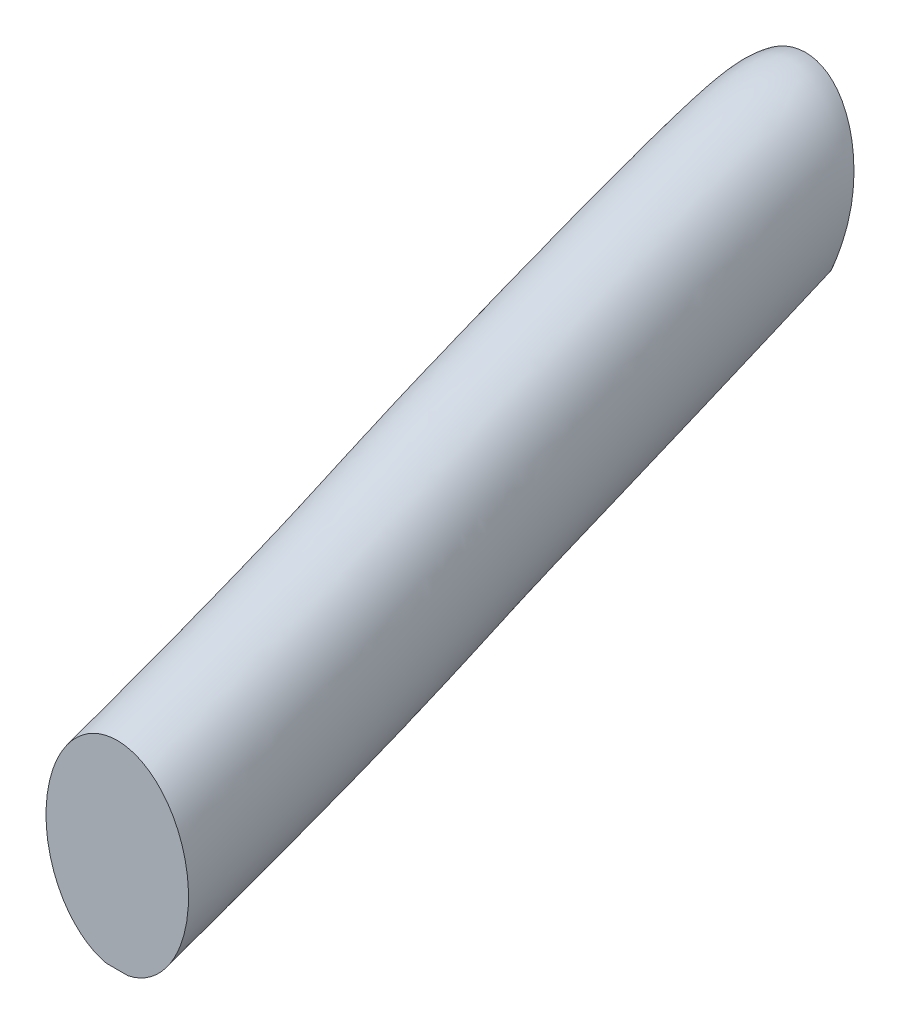
ISO-10303-21;
HEADER;
FILE_DESCRIPTION(('STEP AP214'),'2;1');
FILE_NAME('part.step','',(''),(''),'','','');
FILE_SCHEMA(('AUTOMOTIVE_DESIGN { 1 0 10303 214 1 1 1 1 }'));
ENDSEC;
DATA;
#1=APPLICATION_CONTEXT('core data for automotive mechanical design processes');
#2=APPLICATION_PROTOCOL_DEFINITION('international standard','automotive_design',2000,#1);
#3=PRODUCT_CONTEXT('',#1,'mechanical');
#4=PRODUCT('Part','Part','',(#3));
#5=PRODUCT_RELATED_PRODUCT_CATEGORY('part','',(#4));
#6=PRODUCT_DEFINITION_FORMATION('','',#4);
#7=PRODUCT_DEFINITION_CONTEXT('part definition',#1,'design');
#8=PRODUCT_DEFINITION('design','',#6,#7);
#9=PRODUCT_DEFINITION_SHAPE('','',#8);
#10=(LENGTH_UNIT() NAMED_UNIT(*) SI_UNIT(.MILLI.,.METRE.));
#11=(NAMED_UNIT(*) PLANE_ANGLE_UNIT() SI_UNIT($,.RADIAN.));
#12=(NAMED_UNIT(*) SI_UNIT($,.STERADIAN.) SOLID_ANGLE_UNIT());
#13=UNCERTAINTY_MEASURE_WITH_UNIT(LENGTH_MEASURE(1.E-05),#10,'distance_accuracy_value','');
#14=(GEOMETRIC_REPRESENTATION_CONTEXT(3) GLOBAL_UNCERTAINTY_ASSIGNED_CONTEXT((#13)) GLOBAL_UNIT_ASSIGNED_CONTEXT((#10,
#11,#12)) REPRESENTATION_CONTEXT('',''));
#15=CARTESIAN_POINT('',(0.,0.,0.));
#16=DIRECTION('',(0.,0.,1.));
#17=DIRECTION('',(1.,0.,0.));
#18=AXIS2_PLACEMENT_3D('',#15,#16,#17);
#19=CARTESIAN_POINT('',(0.,0.,0.));
#20=DIRECTION('',(0.,0.,1.));
#21=DIRECTION('',(1.,0.,0.));
#22=AXIS2_PLACEMENT_3D('',#19,#20,#21);
#23=PLANE('',#22);
#24=CARTESIAN_POINT('',(0.,0.,0.));
#25=DIRECTION('',(0.,0.,1.));
#26=DIRECTION('',(0.,1.,0.));
#27=AXIS2_PLACEMENT_3D('',#24,#25,#26);
#28=ELLIPSE('',#27,0.7,0.5);
#29=CARTESIAN_POINT('',(0.076067108572219,-0.691851890354566,0.));
#30=VERTEX_POINT('',#29);
#31=CARTESIAN_POINT('',(-0.0760671085722189,-0.691851890354566,0.));
#32=VERTEX_POINT('',#31);
#33=EDGE_CURVE('E218',#30,#32,#28,.T.);
#34=ORIENTED_EDGE('',*,*,#33,.T.);
#35=DIRECTION('',(1.,0.,0.));
#36=VECTOR('',#35,1.);
#37=CARTESIAN_POINT('',(-0.076067108572219,-0.691851890354566,0.));
#38=LINE('',#37,#36);
#39=EDGE_CURVE('E68',#32,#30,#38,.T.);
#40=ORIENTED_EDGE('',*,*,#39,.T.);
#41=EDGE_LOOP('',(#34,#40));
#42=FACE_BOUND('',#41,.T.);
#43=ADVANCED_FACE('F39',(#42),#23,.T.);
#44=CARTESIAN_POINT('',(0.,1.79407250552899,-4.62944929282827));
#45=DIRECTION('',(0.,0.284057030684601,0.958807385932465));
#46=DIRECTION('',(1.,0.,0.));
#47=AXIS2_PLACEMENT_3D('',#44,#45,#46);
#48=PLANE('',#47);
#49=CARTESIAN_POINT('',(0.,1.79407250552899,-4.62944929282827));
#50=DIRECTION('',(0.,0.284057030684601,0.958807385932465));
#51=DIRECTION('',(0.,0.958807385932465,-0.284057030684601));
#52=AXIS2_PLACEMENT_3D('',#49,#50,#51);
#53=ELLIPSE('',#52,0.7,0.5);
#54=CARTESIAN_POINT('',(0.451753951452625,1.50643028974925,-4.54423218362289));
#55=VERTEX_POINT('',#54);
#56=CARTESIAN_POINT('',(-0.451753951452626,1.50643028974925,-4.54423218362289));
#57=VERTEX_POINT('',#56);
#58=EDGE_CURVE('E100',#55,#57,#53,.T.);
#59=ORIENTED_EDGE('',*,*,#58,.F.);
#60=DIRECTION('',(1.,0.,0.));
#61=VECTOR('',#60,1.);
#62=CARTESIAN_POINT('',(-0.931088401515564,1.50643028974925,-4.54423218362289));
#63=LINE('',#62,#61);
#64=EDGE_CURVE('E174',#57,#55,#63,.T.);
#65=ORIENTED_EDGE('',*,*,#64,.F.);
#66=EDGE_LOOP('',(#59,#65));
#67=FACE_BOUND('',#66,.T.);
#68=ADVANCED_FACE('F199',(#67),#48,.F.);
#69=CARTESIAN_POINT('',(0.0760671085722189,-0.691851890354566,0.));
#70=CARTESIAN_POINT('',(0.0760671085722189,-0.378083679550411,-0.876467249563102));
#71=CARTESIAN_POINT('',(0.0760671085722189,-0.203538118814528,-1.33466995091696));
#72=CARTESIAN_POINT('',(0.0760671085722189,0.0079635270518072,-1.8544641348788));
#73=CARTESIAN_POINT('',(0.0760671085722189,0.0699103434289788,-1.99734938680121));
#74=CARTESIAN_POINT('',(0.0760671085722189,0.201952462257837,-2.29228508424615));
#75=CARTESIAN_POINT('',(0.0760671085722189,0.2721618382492,-2.44532545020458));
#76=CARTESIAN_POINT('',(0.0760671085722189,0.498741000296265,-2.96927096494046));
#77=CARTESIAN_POINT('',(0.0760671085722189,0.681461440509221,-3.4202411755825));
#78=CARTESIAN_POINT('',(0.0760671085722189,0.905545123291567,-3.99853104612914));
#79=CARTESIAN_POINT('',(0.0760671085722189,0.971821970442419,-4.17596467598452));
#80=CARTESIAN_POINT('',(0.0760671085722189,1.0451450481104,-4.37193893175776));
#81=CARTESIAN_POINT('',(0.0760671085722189,1.0650837631674,-4.42603877104979));
#82=CARTESIAN_POINT('',(0.0760671085722189,1.08853422189061,-4.47392966244201));
#83=CARTESIAN_POINT('',(0.0760671085722189,1.09519320233954,-4.48443252187721));
#84=CARTESIAN_POINT('',(0.0760671085722189,1.10882969467951,-4.48387211403926));
#85=CARTESIAN_POINT('',(0.0760671085722189,1.11386559197293,-4.47529175002847));
#86=CARTESIAN_POINT('',(0.0760671085722189,1.13071980308569,-4.43292389918063));
#87=CARTESIAN_POINT('',(0.931088401515564,-0.507597952596941,0.));
#88=CARTESIAN_POINT('',(0.931088401515564,-0.193829741783264,-0.874653425016293));
#89=CARTESIAN_POINT('',(0.931088401515564,-0.0193287250247254,-1.32883147569214));
#90=CARTESIAN_POINT('',(0.931088401515564,0.191829416623497,-1.84232877324497));
#91=CARTESIAN_POINT('',(0.931088401515564,0.253660240107817,-1.98372715293544));
#92=CARTESIAN_POINT('',(0.931088401515564,0.385742349622576,-2.27921347121861));
#93=CARTESIAN_POINT('',(0.931088401515564,0.456077306125904,-2.43402762479262));
#94=CARTESIAN_POINT('',(0.931088401515564,0.682888703257484,-2.9624428627255));
#95=CARTESIAN_POINT('',(0.931088401515564,0.865654639269346,-3.41459343267117));
#96=CARTESIAN_POINT('',(0.931088401515564,1.08980269177384,-3.99751051148023));
#97=CARTESIAN_POINT('',(0.931088401515564,1.15612296677477,-4.17668803878362));
#98=CARTESIAN_POINT('',(0.931088401515564,1.229275753346,-4.37900033597304));
#99=CARTESIAN_POINT('',(0.931088401515564,1.24915938649862,-4.43570777859967));
#100=CARTESIAN_POINT('',(0.931088401515564,1.27196911028698,-4.4914825898225));
#101=CARTESIAN_POINT('',(0.931088401515564,1.2783432280303,-4.50525359560448));
#102=CARTESIAN_POINT('',(0.931088401515564,1.29048554576675,-4.5151540784672));
#103=CARTESIAN_POINT('',(0.931088401515564,1.29482921908736,-4.51310520578428));
#104=CARTESIAN_POINT('',(0.931088401515564,1.30738383949484,-4.485262525632));
#105=CARTESIAN_POINT('',(0.865091088720752,0.7,0.));
#106=CARTESIAN_POINT('',(0.865091088720752,1.01376821087623,-0.862765642124087));
#107=CARTESIAN_POINT('',(0.865091088720752,1.18797728697651,-1.29056618370695));
#108=CARTESIAN_POINT('',(0.865091088720752,1.39688410637057,-1.76279376823277));
#109=CARTESIAN_POINT('',(0.865091088720752,1.45795471391796,-1.89444720632333));
#110=CARTESIAN_POINT('',(0.865091088720752,1.59029892187687,-2.19354228654095));
#111=CARTESIAN_POINT('',(0.865091088720752,1.66145693145024,-2.35998182147191));
#112=CARTESIAN_POINT('',(0.865091088720752,1.88979039435684,-2.91769156809779));
#113=CARTESIAN_POINT('',(0.865091088720752,2.07285450925319,-3.37757819782976));
#114=CARTESIAN_POINT('',(0.865091088720752,2.29742444009366,-3.99082194043765));
#115=CARTESIAN_POINT('',(0.865091088720752,2.36402934066897,-4.18142894932111));
#116=CARTESIAN_POINT('',(0.865091088720752,2.43606604156893,-4.42528068892858));
#117=CARTESIAN_POINT('',(0.865091088720752,2.45558866862444,-4.49907833047481));
#118=CARTESIAN_POINT('',(0.865091088720752,2.47419902384086,-4.60652425148101));
#119=CARTESIAN_POINT('',(0.865091088720752,2.47870615505317,-4.64171464664051));
#120=CARTESIAN_POINT('',(0.865091088720752,2.4810556715394,-4.72017567342531));
#121=CARTESIAN_POINT('',(0.865091088720752,2.48086251779143,-4.76093411140786));
#122=CARTESIAN_POINT('',(0.865091088720752,2.46523767568171,-4.82828921430749));
#123=CARTESIAN_POINT('',(0.,0.7,0.));
#124=CARTESIAN_POINT('',(0.,1.01376821087623,-0.862765642124087));
#125=CARTESIAN_POINT('',(0.,1.18797728697651,-1.29056618370695));
#126=CARTESIAN_POINT('',(0.,1.39688410637057,-1.76279376823277));
#127=CARTESIAN_POINT('',(0.,1.45795471391796,-1.89444720632333));
#128=CARTESIAN_POINT('',(0.,1.59029892187687,-2.19354228654095));
#129=CARTESIAN_POINT('',(0.,1.66145693145024,-2.35998182147191));
#130=CARTESIAN_POINT('',(0.,1.88979039435684,-2.91769156809779));
#131=CARTESIAN_POINT('',(0.,2.07285450925319,-3.37757819782976));
#132=CARTESIAN_POINT('',(0.,2.29742444009366,-3.99082194043765));
#133=CARTESIAN_POINT('',(0.,2.36402934066897,-4.18142894932111));
#134=CARTESIAN_POINT('',(0.,2.43606604156893,-4.42528068892858));
#135=CARTESIAN_POINT('',(0.,2.45558866862444,-4.49907833047481));
#136=CARTESIAN_POINT('',(0.,2.47419902384086,-4.60652425148101));
#137=CARTESIAN_POINT('',(0.,2.47870615505317,-4.64171464664051));
#138=CARTESIAN_POINT('',(0.,2.4810556715394,-4.72017567342531));
#139=CARTESIAN_POINT('',(0.,2.48086251779143,-4.76093411140786));
#140=CARTESIAN_POINT('',(0.,2.46523767568171,-4.82828921430749));
#141=CARTESIAN_POINT('',(-0.865091088720752,0.7,0.));
#142=CARTESIAN_POINT('',(-0.865091088720752,1.01376821087623,-0.862765642124087));
#143=CARTESIAN_POINT('',(-0.865091088720752,1.18797728697651,-1.29056618370695));
#144=CARTESIAN_POINT('',(-0.865091088720752,1.39688410637057,-1.76279376823277));
#145=CARTESIAN_POINT('',(-0.865091088720752,1.45795471391796,-1.89444720632333));
#146=CARTESIAN_POINT('',(-0.865091088720752,1.59029892187687,-2.19354228654095));
#147=CARTESIAN_POINT('',(-0.865091088720752,1.66145693145024,-2.35998182147191));
#148=CARTESIAN_POINT('',(-0.865091088720752,1.88979039435684,-2.91769156809779));
#149=CARTESIAN_POINT('',(-0.865091088720752,2.07285450925319,-3.37757819782976));
#150=CARTESIAN_POINT('',(-0.865091088720752,2.29742444009366,-3.99082194043765));
#151=CARTESIAN_POINT('',(-0.865091088720752,2.36402934066897,-4.18142894932111));
#152=CARTESIAN_POINT('',(-0.865091088720752,2.43606604156893,-4.42528068892858));
#153=CARTESIAN_POINT('',(-0.865091088720752,2.45558866862444,-4.49907833047481));
#154=CARTESIAN_POINT('',(-0.865091088720752,2.47419902384086,-4.60652425148101));
#155=CARTESIAN_POINT('',(-0.865091088720752,2.47870615505317,-4.64171464664051));
#156=CARTESIAN_POINT('',(-0.865091088720752,2.4810556715394,-4.72017567342531));
#157=CARTESIAN_POINT('',(-0.865091088720752,2.48086251779143,-4.76093411140786));
#158=CARTESIAN_POINT('',(-0.865091088720752,2.46523767568171,-4.82828921430749));
#159=CARTESIAN_POINT('',(-0.931088401515564,-0.507597952596941,0.));
#160=CARTESIAN_POINT('',(-0.931088401515564,-0.193829741783264,-0.874653425016293));
#161=CARTESIAN_POINT('',(-0.931088401515564,-0.0193287250247255,-1.32883147569214));
#162=CARTESIAN_POINT('',(-0.931088401515564,0.191829416623497,-1.84232877324497));
#163=CARTESIAN_POINT('',(-0.931088401515564,0.253660240107817,-1.98372715293544));
#164=CARTESIAN_POINT('',(-0.931088401515564,0.385742349622576,-2.27921347121861));
#165=CARTESIAN_POINT('',(-0.931088401515564,0.456077306125903,-2.43402762479262));
#166=CARTESIAN_POINT('',(-0.931088401515564,0.682888703257484,-2.9624428627255));
#167=CARTESIAN_POINT('',(-0.931088401515564,0.865654639269346,-3.41459343267117));
#168=CARTESIAN_POINT('',(-0.931088401515564,1.08980269177384,-3.99751051148023));
#169=CARTESIAN_POINT('',(-0.931088401515564,1.15612296677477,-4.17668803878362));
#170=CARTESIAN_POINT('',(-0.931088401515564,1.229275753346,-4.37900033597304));
#171=CARTESIAN_POINT('',(-0.931088401515564,1.24915938649862,-4.43570777859967));
#172=CARTESIAN_POINT('',(-0.931088401515564,1.27196911028698,-4.4914825898225));
#173=CARTESIAN_POINT('',(-0.931088401515564,1.2783432280303,-4.50525359560448));
#174=CARTESIAN_POINT('',(-0.931088401515564,1.29048554576675,-4.5151540784672));
#175=CARTESIAN_POINT('',(-0.931088401515564,1.29482921908735,-4.51310520578428));
#176=CARTESIAN_POINT('',(-0.931088401515564,1.30738383949484,-4.485262525632));
#177=CARTESIAN_POINT('',(-0.0760671085722188,-0.691851890354566,0.));
#178=CARTESIAN_POINT('',(-0.0760671085722188,-0.378083679550411,-0.876467249563102));
#179=CARTESIAN_POINT('',(-0.0760671085722188,-0.203538118814528,-1.33466995091696));
#180=CARTESIAN_POINT('',(-0.0760671085722188,0.0079635270518072,-1.8544641348788));
#181=CARTESIAN_POINT('',(-0.0760671085722188,0.0699103434289788,-1.99734938680121));
#182=CARTESIAN_POINT('',(-0.0760671085722188,0.201952462257837,-2.29228508424615));
#183=CARTESIAN_POINT('',(-0.0760671085722188,0.2721618382492,-2.44532545020458));
#184=CARTESIAN_POINT('',(-0.0760671085722188,0.498741000296265,-2.96927096494046));
#185=CARTESIAN_POINT('',(-0.0760671085722188,0.681461440509221,-3.4202411755825));
#186=CARTESIAN_POINT('',(-0.0760671085722188,0.905545123291567,-3.99853104612914));
#187=CARTESIAN_POINT('',(-0.0760671085722188,0.971821970442419,-4.17596467598452));
#188=CARTESIAN_POINT('',(-0.0760671085722188,1.0451450481104,-4.37193893175776));
#189=CARTESIAN_POINT('',(-0.0760671085722188,1.0650837631674,-4.42603877104979));
#190=CARTESIAN_POINT('',(-0.0760671085722188,1.08853422189061,-4.47392966244201));
#191=CARTESIAN_POINT('',(-0.0760671085722188,1.09519320233954,-4.48443252187721));
#192=CARTESIAN_POINT('',(-0.0760671085722188,1.10882969467951,-4.48387211403926));
#193=CARTESIAN_POINT('',(-0.0760671085722188,1.11386559197293,-4.47529175002847));
#194=CARTESIAN_POINT('',(-0.0760671085722188,1.13071980308569,-4.43292389918063));
#195=(BOUNDED_SURFACE() B_SPLINE_SURFACE(3,3,((#69,#70,#71,#72,#73,#74,#75,#76,#77,#78,#79,#80,
#81,#82,#83,#84,#85,#86),(#87,#88,#89,#90,#91,#92,#93,#94,#95,#96,#97,#98,#99,#100,#101,#102,
#103,#104),(#105,#106,#107,#108,#109,#110,#111,#112,#113,#114,#115,#116,#117,#118,#119,#120,
#121,#122),(#123,#124,#125,#126,#127,#128,#129,#130,#131,#132,#133,#134,#135,#136,#137,#138,
#139,#140),(#141,#142,#143,#144,#145,#146,#147,#148,#149,#150,#151,#152,#153,#154,#155,#156,
#157,#158),(#159,#160,#161,#162,#163,#164,#165,#166,#167,#168,#169,#170,#171,#172,#173,#174,
#175,#176),(#177,#178,#179,#180,#181,#182,#183,#184,#185,#186,#187,#188,#189,#190,#191,#192,
#193,#194)),.UNSPECIFIED.,.F.,.F.,.F.) B_SPLINE_SURFACE_WITH_KNOTS((4,3,4),(4,2,2,2,2,2,2,2,4),
(0.,0.5,1.),(0.,0.279901070202692,0.419851605304038,0.559802140405384,0.779901070202692,
0.889950535101346,0.944975267550673,0.972487633775337,1.),
.UNSPECIFIED.) GEOMETRIC_REPRESENTATION_ITEM() RATIONAL_B_SPLINE_SURFACE(((1.,1.,1.,1.,1.,1.,1.,
1.,1.,1.,1.,1.,1.,1.,1.,1.,1.,1.),(0.384192958526025,0.384192958526025,0.384192958526025,
0.384192958526025,0.384192958526025,0.384192958526025,0.384192958526025,0.384192958526025,
0.384192958526025,0.384192958526025,0.384192958526025,0.384192958526025,0.384192958526025,
0.384192958526025,0.384192958526025,0.384192958526025,0.384192958526025,0.384192958526025),
(0.384192958526025,0.384192958526025,0.384192958526025,0.384192958526025,0.384192958526025,
0.384192958526025,0.384192958526025,0.384192958526025,0.384192958526025,0.384192958526025,
0.384192958526025,0.384192958526025,0.384192958526025,0.384192958526025,0.384192958526025,
0.384192958526025,0.384192958526025,0.384192958526025),(1.,1.,1.,1.,1.,1.,1.,1.,1.,1.,1.,1.,1.,
1.,1.,1.,1.,1.),(0.384192958526025,0.384192958526025,0.384192958526025,0.384192958526025,
0.384192958526025,0.384192958526025,0.384192958526025,0.384192958526025,0.384192958526025,
0.384192958526025,0.384192958526025,0.384192958526025,0.384192958526025,0.384192958526025,
0.384192958526025,0.384192958526025,0.384192958526025,0.384192958526025),(0.384192958526025,
0.384192958526025,0.384192958526025,0.384192958526025,0.384192958526025,0.384192958526025,
0.384192958526025,0.384192958526025,0.384192958526025,0.384192958526025,0.384192958526025,
0.384192958526025,0.384192958526025,0.384192958526025,0.384192958526025,0.384192958526025,
0.384192958526025,0.384192958526025),(1.,1.,1.,1.,1.,1.,1.,1.,1.,1.,1.,1.,1.,1.,1.,1.,1.,1.))) REPRESENTATION_ITEM('') SURFACE());
#196=CARTESIAN_POINT('',(-0.456842121384779,1.50643028974921,-4.54423218362268));
#197=CARTESIAN_POINT('',(-0.456708170176455,1.50295640760899,-4.53745615603749));
#198=CARTESIAN_POINT('',(-0.456452318415962,1.49948461355091,-4.53068420138897));
#199=CARTESIAN_POINT('',(-0.455812778868111,1.49254354322244,-4.51714520319659));
#200=CARTESIAN_POINT('',(-0.455429098975308,1.48907426680983,-4.5103781593753));
#201=CARTESIAN_POINT('',(-0.454649838087407,1.48213627863114,-4.49684517311163));
#202=CARTESIAN_POINT('',(-0.454254257551835,1.47866756684844,-4.49007923063684));
#203=CARTESIAN_POINT('',(-0.453454840869501,1.4717302496994,-4.47654755325909));
#204=CARTESIAN_POINT('',(-0.453051004598075,1.46826164433545,-4.46978181836082));
#205=CARTESIAN_POINT('',(-0.451832532577263,1.45785616399192,-4.44948526856441));
#206=CARTESIAN_POINT('',(-0.451010915946354,1.45091947026903,-4.435954807219));
#207=CARTESIAN_POINT('',(-0.449357639064085,1.43704627739959,-4.40889426406142));
#208=CARTESIAN_POINT('',(-0.448525978743171,1.43010977825472,-4.39536418225254));
#209=CARTESIAN_POINT('',(-0.444377852822874,1.39544822213112,-4.32775461722867));
#210=CARTESIAN_POINT('',(-0.44108429166909,1.36772260199144,-4.27367403553357));
#211=CARTESIAN_POINT('',(-0.434491243842117,1.3122714237687,-4.16551299318794));
#212=CARTESIAN_POINT('',(-0.431191757151691,1.28454586568605,-4.11143253253822));
#213=CARTESIAN_POINT('',(-0.420727790594454,1.19748834326556,-3.94162130992973));
#214=CARTESIAN_POINT('',(-0.413445474516609,1.13815931179989,-3.82589626872454));
#215=CARTESIAN_POINT('',(-0.398537576896266,1.01951031153995,-3.59446386362971));
#216=CARTESIAN_POINT('',(-0.390911996016514,0.960190342728414,-3.47875649970636));
#217=CARTESIAN_POINT('',(-0.375274431603778,0.841560147104086,-3.24736077424658));
#218=CARTESIAN_POINT('',(-0.367262442163779,0.782249920454142,-3.13167241302777));
#219=CARTESIAN_POINT('',(-0.355166610385431,0.69328670046277,-2.958144006362));
#220=CARTESIAN_POINT('',(-0.351121684357427,0.663632592680179,-2.90030178712682));
#221=CARTESIAN_POINT('',(-0.343128198349149,0.604321700326007,-2.78461212740965));
#222=CARTESIAN_POINT('',(-0.339179638328546,0.57466491575555,-2.72676468692986));
#223=CARTESIAN_POINT('',(-0.335340414796395,0.545005070504413,-2.66891127639816));
#224=B_SPLINE_CURVE_WITH_KNOTS('',3,(#196,#197,#198,#199,#200,#201,#202,#203,#204,#205,#206,
#207,#208,#209,#210,#211,#212,#213,#214,#215,#216,#217,#218,#219,#220,#221,#222,#223),
.UNSPECIFIED.,.F.,.F.,(4,2,2,2,2,2,2,2,2,2,2,2,2,4),(0.,0.0228431989771767,0.0456849874393485,
0.06852589502788,0.0913671477776108,0.137048635981373,0.182730440715862,0.365318519887441,
0.54790713100473,0.93865889327467,1.32940990114577,1.72016688430863,1.9155460934081,
2.11092522074046),.UNSPECIFIED.);
#225=CARTESIAN_POINT('',(-0.456842121384778,1.50643028974925,-4.54423218362289));
#226=VERTEX_POINT('',#225);
#227=CARTESIAN_POINT('',(-0.335340414796396,0.545005070504411,-2.66891127639815));
#228=VERTEX_POINT('',#227);
#229=EDGE_CURVE('E11',#226,#228,#224,.T.);
#230=CARTESIAN_POINT('',(-0.335340414796395,0.545005070504411,-2.66891127639815));
#231=CARTESIAN_POINT('',(-0.328634550008696,0.532525252100501,-2.65996117116368));
#232=CARTESIAN_POINT('',(-0.321637029926896,0.52014427496712,-2.65108195155784));
#233=CARTESIAN_POINT('',(-0.30689703126086,0.495523609031318,-2.63342483957622));
#234=CARTESIAN_POINT('',(-0.299147703198675,0.483286635722726,-2.62464889466111));
#235=CARTESIAN_POINT('',(-0.282845817112019,0.459110640518699,-2.60731068554451));
#236=CARTESIAN_POINT('',(-0.274290465588623,0.447172851028865,-2.5987493051828));
#237=CARTESIAN_POINT('',(-0.256794874066857,0.424417292031208,-2.58242978504985));
#238=CARTESIAN_POINT('',(-0.247904280336617,0.413574451596136,-2.57465366525438));
#239=CARTESIAN_POINT('',(-0.229226618986457,0.392451468309952,-2.55950497340979));
#240=CARTESIAN_POINT('',(-0.219442221190542,0.382169787313007,-2.55213129825431));
#241=CARTESIAN_POINT('',(-0.19883302840451,0.36235171787905,-2.53791844665365));
#242=CARTESIAN_POINT('',(-0.18801026689959,0.352813936478713,-2.53107827122212));
#243=CARTESIAN_POINT('',(-0.162143804819896,0.332378411690913,-2.5164226014477));
#244=CARTESIAN_POINT('',(-0.146734396968897,0.321772134518584,-2.50881613685294));
#245=CARTESIAN_POINT('',(-0.121790734893576,0.30765632271037,-2.49869275227598));
#246=CARTESIAN_POINT('',(-0.113061930110173,0.303210417560976,-2.49550429891378));
#247=CARTESIAN_POINT('',(-0.0950058698671406,0.295141385231279,-2.48971746082417));
#248=CARTESIAN_POINT('',(-0.0856764181512536,0.291521526528306,-2.48712142013857));
#249=CARTESIAN_POINT('',(-0.0760671085722188,0.288412279785641,-2.48489157314512));
#250=B_SPLINE_CURVE_WITH_KNOTS('',3,(#230,#231,#232,#233,#234,#235,#236,#237,#238,#239,#240,
#241,#242,#243,#244,#245,#246,#247,#248,#249),.UNSPECIFIED.,.F.,.F.,(4,2,2,2,2,2,2,2,2,4),(0.,
0.0502777416749106,0.101066557353383,0.152038369219905,0.200108113552448,0.24803869497076,
0.295877256192036,0.356157860021046,0.387002684930197,0.417967517619365),.UNSPECIFIED.);
#251=CARTESIAN_POINT('',(-0.076067108572219,0.288412279785641,-2.48489157314512));
#252=VERTEX_POINT('',#251);
#253=EDGE_CURVE('E95',#228,#252,#250,.T.);
#254=CARTESIAN_POINT('',(-0.0760671085722188,-0.691851890354566,0.));
#255=CARTESIAN_POINT('',(-0.0760671085722188,-0.378083679550411,-0.876467249563102));
#256=CARTESIAN_POINT('',(-0.0760671085722188,-0.203538118814528,-1.33466995091696));
#257=CARTESIAN_POINT('',(-0.0760671085722188,0.0079635270518072,-1.8544641348788));
#258=CARTESIAN_POINT('',(-0.0760671085722188,0.0699103434289788,-1.99734938680121));
#259=CARTESIAN_POINT('',(-0.0760671085722188,0.201952462257837,-2.29228508424615));
#260=CARTESIAN_POINT('',(-0.0760671085722188,0.2721618382492,-2.44532545020458));
#261=CARTESIAN_POINT('',(-0.0760671085722188,0.498741000296265,-2.96927096494046));
#262=CARTESIAN_POINT('',(-0.0760671085722188,0.681461440509221,-3.4202411755825));
#263=CARTESIAN_POINT('',(-0.0760671085722188,0.905545123291567,-3.99853104612914));
#264=CARTESIAN_POINT('',(-0.0760671085722188,0.971821970442419,-4.17596467598452));
#265=CARTESIAN_POINT('',(-0.0760671085722188,1.0451450481104,-4.37193893175776));
#266=CARTESIAN_POINT('',(-0.0760671085722188,1.0650837631674,-4.42603877104979));
#267=CARTESIAN_POINT('',(-0.0760671085722188,1.08853422189061,-4.47392966244201));
#268=CARTESIAN_POINT('',(-0.0760671085722188,1.09519320233954,-4.48443252187721));
#269=CARTESIAN_POINT('',(-0.0760671085722188,1.10882969467951,-4.48387211403926));
#270=CARTESIAN_POINT('',(-0.0760671085722188,1.11386559197293,-4.47529175002847));
#271=CARTESIAN_POINT('',(-0.0760671085722188,1.13071980308569,-4.43292389918063));
#272=B_SPLINE_CURVE_WITH_KNOTS('',3,(#254,#255,#256,#257,#258,#259,#260,#261,#262,#263,#264,
#265,#266,#267,#268,#269,#270,#271),.UNSPECIFIED.,.F.,.F.,(4,2,2,2,2,2,2,2,4),(0.,
0.279901070202692,0.419851605304038,0.559802140405384,0.779901070202692,0.889950535101346,
0.944975267550673,0.972487633775337,1.),.UNSPECIFIED.);
#273=EDGE_CURVE('E105',#32,#252,#272,.T.);
#274=CARTESIAN_POINT('',(0.0760671085722189,-0.691851890354566,0.));
#275=CARTESIAN_POINT('',(0.0760671085722189,-0.378083679550411,-0.876467249563102));
#276=CARTESIAN_POINT('',(0.0760671085722189,-0.203538118814528,-1.33466995091696));
#277=CARTESIAN_POINT('',(0.0760671085722189,0.0079635270518072,-1.8544641348788));
#278=CARTESIAN_POINT('',(0.0760671085722189,0.0699103434289788,-1.99734938680121));
#279=CARTESIAN_POINT('',(0.0760671085722189,0.201952462257837,-2.29228508424615));
#280=CARTESIAN_POINT('',(0.0760671085722189,0.2721618382492,-2.44532545020458));
#281=CARTESIAN_POINT('',(0.0760671085722189,0.498741000296265,-2.96927096494046));
#282=CARTESIAN_POINT('',(0.0760671085722189,0.681461440509221,-3.4202411755825));
#283=CARTESIAN_POINT('',(0.0760671085722189,0.905545123291567,-3.99853104612914));
#284=CARTESIAN_POINT('',(0.0760671085722189,0.971821970442419,-4.17596467598452));
#285=CARTESIAN_POINT('',(0.0760671085722189,1.0451450481104,-4.37193893175776));
#286=CARTESIAN_POINT('',(0.0760671085722189,1.0650837631674,-4.42603877104979));
#287=CARTESIAN_POINT('',(0.0760671085722189,1.08853422189061,-4.47392966244201));
#288=CARTESIAN_POINT('',(0.0760671085722189,1.09519320233954,-4.48443252187721));
#289=CARTESIAN_POINT('',(0.0760671085722189,1.10882969467951,-4.48387211403926));
#290=CARTESIAN_POINT('',(0.0760671085722189,1.11386559197293,-4.47529175002847));
#291=CARTESIAN_POINT('',(0.0760671085722189,1.13071980308569,-4.43292389918063));
#292=B_SPLINE_CURVE_WITH_KNOTS('',3,(#274,#275,#276,#277,#278,#279,#280,#281,#282,#283,#284,
#285,#286,#287,#288,#289,#290,#291),.UNSPECIFIED.,.F.,.F.,(4,2,2,2,2,2,2,2,4),(0.,
0.279901070202692,0.419851605304038,0.559802140405384,0.779901070202692,0.889950535101346,
0.944975267550673,0.972487633775337,1.),.UNSPECIFIED.);
#293=CARTESIAN_POINT('',(0.0760671085722189,0.288412279785641,-2.48489157314512));
#294=VERTEX_POINT('',#293);
#295=EDGE_CURVE('E112',#30,#294,#292,.T.);
#296=CARTESIAN_POINT('',(0.0760671085722189,0.288412275212337,-2.48489156728302));
#297=CARTESIAN_POINT('',(0.0899722162658052,0.292919586750989,-2.48812406087914));
#298=CARTESIAN_POINT('',(0.103260023729405,0.298468919186074,-2.49210385579537));
#299=CARTESIAN_POINT('',(0.128468310825353,0.311083089147925,-2.50115031394722));
#300=CARTESIAN_POINT('',(0.14040473480543,0.31812660911361,-2.50620168895784));
#301=CARTESIAN_POINT('',(0.171697915605207,0.339014206719118,-2.52118156989191));
#302=CARTESIAN_POINT('',(0.189886367054301,0.353989777105549,-2.53192154445833));
#303=CARTESIAN_POINT('',(0.223669445774024,0.386023851173333,-2.5548953030272));
#304=CARTESIAN_POINT('',(0.239226012918357,0.403107597316707,-2.567147190071));
#305=CARTESIAN_POINT('',(0.269862467123012,0.440628759253672,-2.59405610306069));
#306=CARTESIAN_POINT('',(0.284651832030394,0.461220890751858,-2.60882408590132));
#307=CARTESIAN_POINT('',(0.304993011616345,0.49253647403467,-2.63128256701355));
#308=CARTESIAN_POINT('',(0.31139443661109,0.502908753788697,-2.63872121654413));
#309=CARTESIAN_POINT('',(0.3237145317387,0.523830338010692,-2.65372547176504));
#310=CARTESIAN_POINT('',(0.329633612326344,0.534379482557768,-2.66129096276549));
#311=CARTESIAN_POINT('',(0.335340414796405,0.545005070504421,-2.66891127639814));
#312=B_SPLINE_CURVE_WITH_KNOTS('',3,(#296,#297,#298,#299,#300,#301,#302,#303,#304,#305,#306,
#307,#308,#309,#310,#311),.UNSPECIFIED.,.F.,.F.,(4,2,2,2,2,2,2,4),(0.,0.0447011242034167,
0.0888028946444298,0.166062077263919,0.244357459690865,0.332219954440857,0.375051213635917,
0.417845636123864),.UNSPECIFIED.);
#313=CARTESIAN_POINT('',(0.335340414796395,0.545005070504411,-2.66891127639815));
#314=VERTEX_POINT('',#313);
#315=EDGE_CURVE('E60',#294,#314,#312,.T.);
#316=CARTESIAN_POINT('',(0.335340414796395,0.545005070504411,-2.66891127639815));
#317=CARTESIAN_POINT('',(0.338186518497698,0.567052498836593,-2.71191618460551));
#318=CARTESIAN_POINT('',(0.341101703524113,0.589098013303498,-2.75491735969721));
#319=CARTESIAN_POINT('',(0.347006236924518,0.633187048704735,-2.84091582136879));
#320=CARTESIAN_POINT('',(0.349995585520202,0.65523056963291,-2.88391310793668));
#321=CARTESIAN_POINT('',(0.358978877699041,0.721360894458613,-3.01290450348647));
#322=CARTESIAN_POINT('',(0.364988040858047,0.765447261640207,-3.09889776062619));
#323=CARTESIAN_POINT('',(0.376854719716106,0.853624236553152,-3.27089254636754));
#324=CARTESIAN_POINT('',(0.382712235539083,0.897714844281008,-3.35689407496236));
#325=CARTESIAN_POINT('',(0.39995756421085,1.02999513603184,-3.61491517922197));
#326=CARTESIAN_POINT('',(0.411018220248886,1.11819373043442,-3.78695213514494));
#327=CARTESIAN_POINT('',(0.424797765086138,1.23138911461887,-4.00774691597338));
#328=CARTESIAN_POINT('',(0.427813777729107,1.25637850737902,-4.05649031251146));
#329=CARTESIAN_POINT('',(0.433796345802235,1.30635857771703,-4.15397961170422));
#330=CARTESIAN_POINT('',(0.43676290113623,1.33134925529729,-4.20272551436359));
#331=CARTESIAN_POINT('',(0.441208833207118,1.36883569135542,-4.27584518698069));
#332=CARTESIAN_POINT('',(0.442690179739213,1.38133140326418,-4.3002188661022));
#333=CARTESIAN_POINT('',(0.445673350098201,1.40632228996009,-4.34896517665536));
#334=CARTESIAN_POINT('',(0.447175173871093,1.41881746474857,-4.3733378080896));
#335=CARTESIAN_POINT('',(0.449420085797631,1.43757100344209,-4.40991777550926));
#336=CARTESIAN_POINT('',(0.450167712905401,1.44382926059782,-4.42212490327333));
#337=CARTESIAN_POINT('',(0.451652665187481,1.45634600887869,-4.44653961517368));
#338=CARTESIAN_POINT('',(0.452389990434518,1.46260450000188,-4.45874719930613));
#339=CARTESIAN_POINT('',(0.453850389153431,1.4751218795079,-4.4831631424512));
#340=CARTESIAN_POINT('',(0.454573462308588,1.48138076789648,-4.49537150147501));
#341=CARTESIAN_POINT('',(0.455610383030487,1.49077058308109,-4.51368693191952));
#342=CARTESIAN_POINT('',(0.455948079896384,1.49390081639854,-4.51979265066622));
#343=CARTESIAN_POINT('',(0.456507313016813,1.50016352993848,-4.53200847089053));
#344=CARTESIAN_POINT('',(0.456728841221635,1.50329601030162,-4.53811857264248));
#345=CARTESIAN_POINT('',(0.456842121384736,1.50643028974915,-4.54423218362271));
#346=B_SPLINE_CURVE_WITH_KNOTS('',3,(#316,#317,#318,#319,#320,#321,#322,#323,#324,#325,#326,
#327,#328,#329,#330,#331,#332,#333,#334,#335,#336,#337,#338,#339,#340,#341,#342,#343,#344,#345),
.UNSPECIFIED.,.F.,.F.,(4,2,2,2,2,2,2,2,2,2,2,2,2,2,4),(0.,0.145232364798977,0.290465163788017,
0.580932071242895,0.871398741323432,1.45232917025903,1.61690549004339,1.781482129788,
1.86377260014325,1.94606285353355,1.98727754333676,2.02849194203226,2.06970725558919,
2.09031554191625,2.11092525607092),.UNSPECIFIED.);
#347=CARTESIAN_POINT('',(0.456842121384778,1.50643028974925,-4.54423218362289));
#348=VERTEX_POINT('',#347);
#349=EDGE_CURVE('E139',#314,#348,#346,.T.);
#350=CARTESIAN_POINT('',(0.456842121384778,1.50643028974921,-4.54423218362268));
#351=CARTESIAN_POINT('',(0.456134562289902,1.50516192086275,-4.54547638369811));
#352=CARTESIAN_POINT('',(0.45551896286832,1.50387952566077,-4.54673434282417));
#353=CARTESIAN_POINT('',(0.454426893918066,1.50200252614016,-4.54857557606506));
#354=CARTESIAN_POINT('',(0.454034650239852,1.50138448910911,-4.5491818363824));
#355=CARTESIAN_POINT('',(0.45336524878082,1.50047696952468,-4.55007206315246));
#356=CARTESIAN_POINT('',(0.453128290279634,1.50017738640369,-4.55036593770725));
#357=CARTESIAN_POINT('',(0.452760239139312,1.49987103599814,-4.55066645059672));
#358=CARTESIAN_POINT('',(0.452699646919654,1.49982418784324,-4.55071240605866));
#359=CARTESIAN_POINT('',(0.452566866157425,1.49973751976896,-4.55079742267302));
#360=CARTESIAN_POINT('',(0.452494612020149,1.49969774244962,-4.55083644203715));
#361=CARTESIAN_POINT('',(0.452377299516523,1.49965764398186,-4.55087577642133));
#362=CARTESIAN_POINT('',(0.452339373600211,1.49964767442186,-4.55088555600779));
#363=CARTESIAN_POINT('',(0.452259969804419,1.49963693814366,-4.55089608770469));
#364=CARTESIAN_POINT('',(0.452218460676613,1.49963626284359,-4.55089675013902));
#365=CARTESIAN_POINT('',(0.452143448919426,1.49964675989718,-4.55088645311013));
#366=CARTESIAN_POINT('',(0.452109574691236,1.49965657726205,-4.55087682281646));
#367=CARTESIAN_POINT('',(0.452039337211195,1.49968681603841,-4.5508471602413));
#368=CARTESIAN_POINT('',(0.452005011088893,1.49970946071718,-4.55082494705639));
#369=CARTESIAN_POINT('',(0.451919690599842,1.49978015939754,-4.55075559554012));
#370=CARTESIAN_POINT('',(0.451878702780121,1.49983364434081,-4.55070312975543));
#371=CARTESIAN_POINT('',(0.451721503514003,1.50007887751912,-4.55046256950672));
#372=CARTESIAN_POINT('',(0.451668877835046,1.5002864969837,-4.55025890623459));
#373=CARTESIAN_POINT('',(0.451420700351551,1.50149453841728,-4.54907388405504));
#374=CARTESIAN_POINT('',(0.451445356568401,1.50249915301666,-4.5480884124225));
#375=CARTESIAN_POINT('',(0.451602986780889,1.50448103058866,-4.54614429959721));
#376=CARTESIAN_POINT('',(0.451733141399369,1.50545832864643,-4.54518562398788));
#377=CARTESIAN_POINT('',(0.451753951452625,1.50643028974925,-4.54423218362289));
#378=B_SPLINE_CURVE_WITH_KNOTS('',3,(#350,#351,#352,#353,#354,#355,#356,#357,#358,#359,#360,
#361,#362,#363,#364,#365,#366,#367,#368,#369,#370,#371,#372,#373,#374,#375,#376,#377),
.UNSPECIFIED.,.F.,.F.,(4,2,2,2,2,2,2,2,2,2,2,2,2,4),(0.,0.0057070440105756,0.00856187268017827,
0.00999257501297054,0.0102603870320646,0.0105297615659897,0.0106497856960203,0.0107709895464286,
0.01087824003243,0.0110160254330884,0.0112688328332871,0.0121447323254333,0.0163606474914728,
0.020467470201215),.UNSPECIFIED.);
#379=EDGE_CURVE('E99',#348,#55,#378,.T.);
#380=CARTESIAN_POINT('',(-0.451753951452626,1.50643028974925,-4.54423218362289));
#381=CARTESIAN_POINT('',(-0.451818736865495,1.50493541281629,-4.54569857563132));
#382=CARTESIAN_POINT('',(-0.451484933828612,1.50340190815629,-4.54720285931429));
#383=CARTESIAN_POINT('',(-0.451499260417851,1.50150226372151,-4.54906630596771));
#384=CARTESIAN_POINT('',(-0.451523714559756,1.50112313537301,-4.54943821001421));
#385=CARTESIAN_POINT('',(-0.451601956418525,1.50061107822886,-4.54994050989422));
#386=CARTESIAN_POINT('',(-0.451626751018567,1.50047667712863,-4.55007234997747));
#387=CARTESIAN_POINT('',(-0.451686202150343,1.50024878740566,-4.55029589725497));
#388=CARTESIAN_POINT('',(-0.451716034389798,1.50015455501045,-4.55038833404909));
#389=CARTESIAN_POINT('',(-0.451794236386026,1.49996622591259,-4.55057307453037));
#390=CARTESIAN_POINT('',(-0.45184295656778,1.49987216775081,-4.55066534041106));
#391=CARTESIAN_POINT('',(-0.451942929470473,1.49976186504065,-4.55077354129978));
#392=CARTESIAN_POINT('',(-0.451970702949419,1.49973564556991,-4.55079926115773));
#393=CARTESIAN_POINT('',(-0.4520363886099,1.49968913356695,-4.55084488687312));
#394=CARTESIAN_POINT('',(-0.452074397289313,1.49966890150662,-4.55086473341099));
#395=CARTESIAN_POINT('',(-0.452147646765562,1.4996461106663,-4.55088708997105));
#396=CARTESIAN_POINT('',(-0.452180724603449,1.49964020409186,-4.55089288399542));
#397=CARTESIAN_POINT('',(-0.45224748380714,1.49963669981432,-4.5508963214991));
#398=CARTESIAN_POINT('',(-0.452281163722048,1.49963908426992,-4.55089398247973));
#399=CARTESIAN_POINT('',(-0.452366607829203,1.49965308596048,-4.55088024759063));
#400=CARTESIAN_POINT('',(-0.452416556948891,1.49966953221036,-4.55086411472173));
#401=CARTESIAN_POINT('',(-0.452582328728492,1.49973893471218,-4.55079603468155));
#402=CARTESIAN_POINT('',(-0.452681238301376,1.49980912866844,-4.55072717827834));
#403=CARTESIAN_POINT('',(-0.453133028685506,1.50016903796845,-4.55037412707791));
#404=CARTESIAN_POINT('',(-0.453392475916195,1.50050613654308,-4.55004345191564));
#405=CARTESIAN_POINT('',(-0.454614159071643,1.50219785183326,-4.54838397227367));
#406=CARTESIAN_POINT('',(-0.455380844753513,1.5036077091745,-4.54700097983246));
#407=CARTESIAN_POINT('',(-0.456360000776234,1.50549385857388,-4.54515077107697));
#408=CARTESIAN_POINT('',(-0.456599510283788,1.50596251223048,-4.54469104763048));
#409=CARTESIAN_POINT('',(-0.45684212138482,1.50643028974924,-4.54423218362237));
#410=B_SPLINE_CURVE_WITH_KNOTS('',3,(#380,#381,#382,#383,#384,#385,#386,#387,#388,#389,#390,
#391,#392,#393,#394,#395,#396,#397,#398,#399,#400,#401,#402,#403,#404,#405,#406,#407,#408,#409),
.UNSPECIFIED.,.F.,.F.,(4,2,2,2,2,2,2,2,2,2,2,2,2,2,4),(0.,0.00637610647782302,
0.00797047802256094,0.00853911558896184,0.00894569855005239,0.00936021659776877,
0.00949754623303892,0.00963621892144155,0.00973637862398771,0.00983632292845581,
0.00999857196008432,0.0104104981095707,0.0120145842234871,0.0183718276349614,
0.0204681074997478),.UNSPECIFIED.);
#411=EDGE_CURVE('E53',#57,#226,#410,.T.);
#412=ORIENTED_EDGE('',*,*,#229,.T.);
#413=ORIENTED_EDGE('',*,*,#253,.T.);
#414=ORIENTED_EDGE('',*,*,#273,.F.);
#415=ORIENTED_EDGE('',*,*,#33,.F.);
#416=ORIENTED_EDGE('',*,*,#295,.T.);
#417=ORIENTED_EDGE('',*,*,#315,.T.);
#418=ORIENTED_EDGE('',*,*,#349,.T.);
#419=ORIENTED_EDGE('',*,*,#379,.T.);
#420=ORIENTED_EDGE('',*,*,#58,.T.);
#421=ORIENTED_EDGE('',*,*,#411,.T.);
#422=EDGE_LOOP('',(#412,#413,#414,#415,#416,#417,#418,#419,#420,#421));
#423=FACE_BOUND('',#422,.T.);
#424=ADVANCED_FACE('F104',(#423),#195,.F.);
#425=CARTESIAN_POINT('',(-0.076067108572219,-0.691851890354566,0.));
#426=CARTESIAN_POINT('',(-0.076067108572219,-0.378083679550411,-0.876467249563102));
#427=CARTESIAN_POINT('',(-0.076067108572219,-0.203538118814528,-1.33466995091696));
#428=CARTESIAN_POINT('',(-0.076067108572219,0.0079635270518072,-1.8544641348788));
#429=CARTESIAN_POINT('',(-0.076067108572219,0.0699103434289788,-1.99734938680121));
#430=CARTESIAN_POINT('',(-0.076067108572219,0.201952462257837,-2.29228508424615));
#431=CARTESIAN_POINT('',(-0.076067108572219,0.2721618382492,-2.44532545020458));
#432=CARTESIAN_POINT('',(-0.076067108572219,0.498741000296265,-2.96927096494046));
#433=CARTESIAN_POINT('',(-0.076067108572219,0.681461440509221,-3.4202411755825));
#434=CARTESIAN_POINT('',(-0.076067108572219,0.905545123291567,-3.99853104612914));
#435=CARTESIAN_POINT('',(-0.076067108572219,0.971821970442419,-4.17596467598452));
#436=CARTESIAN_POINT('',(-0.076067108572219,1.0451450481104,-4.37193893175776));
#437=CARTESIAN_POINT('',(-0.076067108572219,1.0650837631674,-4.42603877104979));
#438=CARTESIAN_POINT('',(-0.076067108572219,1.08853422189061,-4.47392966244201));
#439=CARTESIAN_POINT('',(-0.076067108572219,1.09519320233954,-4.48443252187721));
#440=CARTESIAN_POINT('',(-0.076067108572219,1.10882969467951,-4.48387211403926));
#441=CARTESIAN_POINT('',(-0.076067108572219,1.11386559197293,-4.47529175002847));
#442=CARTESIAN_POINT('',(-0.076067108572219,1.13071980308569,-4.43292389918063));
#443=CARTESIAN_POINT('',(0.0760671085722191,-0.691851890354566,0.));
#444=CARTESIAN_POINT('',(0.0760671085722191,-0.378083679550411,-0.876467249563102));
#445=CARTESIAN_POINT('',(0.0760671085722191,-0.203538118814528,-1.33466995091696));
#446=CARTESIAN_POINT('',(0.0760671085722191,0.00796352705180731,-1.8544641348788));
#447=CARTESIAN_POINT('',(0.0760671085722191,0.0699103434289789,-1.99734938680121));
#448=CARTESIAN_POINT('',(0.0760671085722191,0.201952462257837,-2.29228508424615));
#449=CARTESIAN_POINT('',(0.0760671085722191,0.2721618382492,-2.44532545020458));
#450=CARTESIAN_POINT('',(0.0760671085722191,0.498741000296266,-2.96927096494046));
#451=CARTESIAN_POINT('',(0.0760671085722191,0.681461440509221,-3.4202411755825));
#452=CARTESIAN_POINT('',(0.0760671085722191,0.905545123291567,-3.99853104612914));
#453=CARTESIAN_POINT('',(0.0760671085722191,0.971821970442402,-4.17596467598452));
#454=CARTESIAN_POINT('',(0.0760671085722191,1.04514504811041,-4.37193893175776));
#455=CARTESIAN_POINT('',(0.0760671085722191,1.0650837631674,-4.42603877104979));
#456=CARTESIAN_POINT('',(0.0760671085722191,1.08853422189061,-4.47392966244201));
#457=CARTESIAN_POINT('',(0.0760671085722191,1.09519320233954,-4.48443252187721));
#458=CARTESIAN_POINT('',(0.0760671085722191,1.10882969467952,-4.48387211403926));
#459=CARTESIAN_POINT('',(0.0760671085722191,1.11386559197293,-4.47529175002847));
#460=CARTESIAN_POINT('',(0.0760671085722191,1.13071980308569,-4.43292389918063));
#461=B_SPLINE_SURFACE_WITH_KNOTS('',1,3,((#425,#426,#427,#428,#429,#430,#431,#432,#433,#434,
#435,#436,#437,#438,#439,#440,#441,#442),(#443,#444,#445,#446,#447,#448,#449,#450,#451,#452,
#453,#454,#455,#456,#457,#458,#459,#460)),.UNSPECIFIED.,.F.,.F.,.F.,(2,2),(4,2,2,2,2,2,2,2,4),
(0.,1.),(0.,0.279901070202692,0.419851605304038,0.559802140405384,0.779901070202692,
0.889950535101346,0.944975267550673,0.972487633775337,1.),.UNSPECIFIED.);
#462=DIRECTION('',(1.,0.,0.));
#463=VECTOR('',#462,1.);
#464=CARTESIAN_POINT('',(0.,0.288412279785639,-2.48489157314511));
#465=LINE('',#464,#463);
#466=EDGE_CURVE('E92',#252,#294,#465,.T.);
#467=ORIENTED_EDGE('',*,*,#273,.T.);
#468=ORIENTED_EDGE('',*,*,#466,.T.);
#469=ORIENTED_EDGE('',*,*,#295,.F.);
#470=ORIENTED_EDGE('',*,*,#39,.F.);
#471=EDGE_LOOP('',(#467,#468,#469,#470));
#472=FACE_BOUND('',#471,.T.);
#473=ADVANCED_FACE('F110',(#472),#461,.F.);
#474=CARTESIAN_POINT('',(-0.931088401515564,-0.651924705180043,-0.334223785483417));
#475=DIRECTION('',(0.,0.889870982929003,0.45621226829292));
#476=DIRECTION('',(0.,-0.45621226829292,0.889870982929003));
#477=AXIS2_PLACEMENT_3D('',#474,#475,#476);
#478=PLANE('',#477);
#479=DIRECTION('',(1.,0.,0.));
#480=VECTOR('',#479,1.);
#481=CARTESIAN_POINT('',(-0.931088401515564,0.545005070504411,-2.66891127639815));
#482=LINE('',#481,#480);
#483=EDGE_CURVE('E108',#228,#314,#482,.T.);
#484=ORIENTED_EDGE('',*,*,#483,.F.);
#485=ORIENTED_EDGE('',*,*,#229,.F.);
#486=EDGE_CURVE('E170',#226,#57,#63,.T.);
#487=ORIENTED_EDGE('',*,*,#486,.T.);
#488=ORIENTED_EDGE('',*,*,#64,.T.);
#489=EDGE_CURVE('E168',#55,#348,#63,.T.);
#490=ORIENTED_EDGE('',*,*,#489,.T.);
#491=ORIENTED_EDGE('',*,*,#349,.F.);
#492=EDGE_LOOP('',(#484,#485,#487,#488,#490,#491));
#493=FACE_BOUND('',#492,.T.);
#494=ADVANCED_FACE('F152',(#493),#478,.F.);
#495=CARTESIAN_POINT('',(-0.931088401515564,3.01042154988868,-3.06889952179762));
#496=DIRECTION('',(0.,0.700272610020728,-0.713875529525111));
#497=DIRECTION('',(0.,0.713875529525111,0.700272610020728));
#498=AXIS2_PLACEMENT_3D('',#495,#496,#497);
#499=PLANE('',#498);
#500=ORIENTED_EDGE('',*,*,#486,.F.);
#501=ORIENTED_EDGE('',*,*,#411,.F.);
#502=EDGE_LOOP('',(#500,#501));
#503=FACE_BOUND('',#502,.T.);
#504=ADVANCED_FACE('F148',(#503),#499,.F.);
#505=ORIENTED_EDGE('',*,*,#489,.F.);
#506=ORIENTED_EDGE('',*,*,#379,.F.);
#507=EDGE_LOOP('',(#505,#506));
#508=FACE_BOUND('',#507,.T.);
#509=ADVANCED_FACE('F151',(#508),#499,.F.);
#510=CARTESIAN_POINT('',(-0.931088401515564,-1.0788565405676,-1.50433244720969));
#511=DIRECTION('',(0.,0.582787153900616,0.81262484163876));
#512=DIRECTION('',(0.,-0.81262484163876,0.582787153900616));
#513=AXIS2_PLACEMENT_3D('',#510,#511,#512);
#514=PLANE('',#513);
#515=ORIENTED_EDGE('',*,*,#466,.F.);
#516=ORIENTED_EDGE('',*,*,#253,.F.);
#517=ORIENTED_EDGE('',*,*,#483,.T.);
#518=ORIENTED_EDGE('',*,*,#315,.F.);
#519=EDGE_LOOP('',(#515,#516,#517,#518));
#520=FACE_BOUND('',#519,.T.);
#521=ADVANCED_FACE('F94',(#520),#514,.F.);
#522=CLOSED_SHELL('',(#43,#68,#424,#473,#494,#504,#509,#521));
#523=MANIFOLD_SOLID_BREP('B2',#522);
#524=ADVANCED_BREP_SHAPE_REPRESENTATION('',(#18,#523),#14);
#525=SHAPE_DEFINITION_REPRESENTATION(#9,#524);
ENDSEC;
END-ISO-10303-21;
